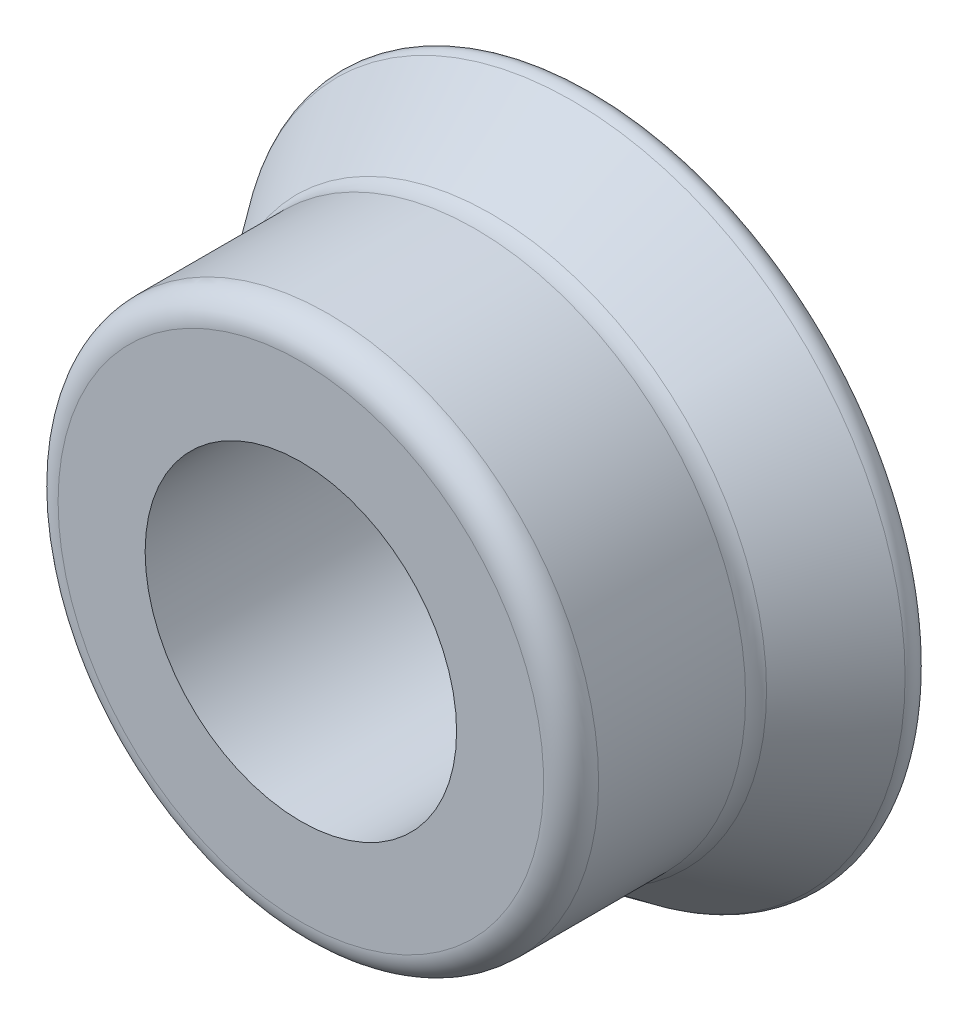
ISO-10303-21;
HEADER;
FILE_DESCRIPTION(('STEP AP214'),'2;1');
FILE_NAME('part.step','',(''),(''),'','','');
FILE_SCHEMA(('AUTOMOTIVE_DESIGN { 1 0 10303 214 1 1 1 1 }'));
ENDSEC;
DATA;
#1=APPLICATION_CONTEXT('core data for automotive mechanical design processes');
#2=APPLICATION_PROTOCOL_DEFINITION('international standard','automotive_design',2000,#1);
#3=PRODUCT_CONTEXT('',#1,'mechanical');
#4=PRODUCT('Part','Part','',(#3));
#5=PRODUCT_RELATED_PRODUCT_CATEGORY('part','',(#4));
#6=PRODUCT_DEFINITION_FORMATION('','',#4);
#7=PRODUCT_DEFINITION_CONTEXT('part definition',#1,'design');
#8=PRODUCT_DEFINITION('design','',#6,#7);
#9=PRODUCT_DEFINITION_SHAPE('','',#8);
#10=(LENGTH_UNIT() NAMED_UNIT(*) SI_UNIT(.MILLI.,.METRE.));
#11=(NAMED_UNIT(*) PLANE_ANGLE_UNIT() SI_UNIT($,.RADIAN.));
#12=(NAMED_UNIT(*) SI_UNIT($,.STERADIAN.) SOLID_ANGLE_UNIT());
#13=UNCERTAINTY_MEASURE_WITH_UNIT(LENGTH_MEASURE(1.E-05),#10,'distance_accuracy_value','');
#14=(GEOMETRIC_REPRESENTATION_CONTEXT(3) GLOBAL_UNCERTAINTY_ASSIGNED_CONTEXT((#13)) GLOBAL_UNIT_ASSIGNED_CONTEXT((#10,
#11,#12)) REPRESENTATION_CONTEXT('',''));
#15=CARTESIAN_POINT('',(0.,0.,0.));
#16=DIRECTION('',(0.,0.,1.));
#17=DIRECTION('',(1.,0.,0.));
#18=AXIS2_PLACEMENT_3D('',#15,#16,#17);
#19=CARTESIAN_POINT('',(0.,0.,0.));
#20=DIRECTION('',(0.,0.,1.));
#21=DIRECTION('',(1.,0.,0.));
#22=AXIS2_PLACEMENT_3D('',#19,#20,#21);
#23=PLANE('',#22);
#24=CARTESIAN_POINT('',(0.,0.,0.));
#25=DIRECTION('',(0.,0.,-1.));
#26=DIRECTION('',(-1.,0.,0.));
#27=AXIS2_PLACEMENT_3D('',#24,#25,#26);
#28=CIRCLE('',#27,3.50993198537684);
#29=CARTESIAN_POINT('',(-3.50993198537684,0.,0.));
#30=VERTEX_POINT('',#29);
#31=EDGE_CURVE('E50',#30,#30,#28,.T.);
#32=ORIENTED_EDGE('',*,*,#31,.T.);
#33=EDGE_LOOP('',(#32));
#34=FACE_BOUND('',#33,.T.);
#35=CARTESIAN_POINT('',(0.,0.,0.));
#36=DIRECTION('',(0.,0.,1.));
#37=DIRECTION('',(1.,0.,0.));
#38=AXIS2_PLACEMENT_3D('',#35,#36,#37);
#39=CIRCLE('',#38,1.7);
#40=CARTESIAN_POINT('',(1.7,0.,0.));
#41=VERTEX_POINT('',#40);
#42=EDGE_CURVE('E69',#41,#41,#39,.F.);
#43=ORIENTED_EDGE('',*,*,#42,.F.);
#44=EDGE_LOOP('',(#43));
#45=FACE_BOUND('',#44,.T.);
#46=ADVANCED_FACE('F37',(#34,#45),#23,.F.);
#47=CARTESIAN_POINT('',(0.,0.,0.15));
#48=DIRECTION('',(0.,0.,-1.));
#49=DIRECTION('',(-1.,0.,0.));
#50=AXIS2_PLACEMENT_3D('',#47,#48,#49);
#51=TOROIDAL_SURFACE('',#50,3.50993198537684,0.15);
#52=ORIENTED_EDGE('',*,*,#31,.F.);
#53=EDGE_LOOP('',(#52));
#54=FACE_BOUND('',#53,.T.);
#55=CARTESIAN_POINT('',(0.,0.,0.236702601117052));
#56=DIRECTION('',(0.,0.,-1.));
#57=DIRECTION('',(-1.,0.,0.));
#58=AXIS2_PLACEMENT_3D('',#55,#56,#57);
#59=CIRCLE('',#58,3.63233565754209);
#60=CARTESIAN_POINT('',(-3.63233565754209,0.,0.236702601117052));
#61=VERTEX_POINT('',#60);
#62=EDGE_CURVE('E55',#61,#61,#59,.T.);
#63=ORIENTED_EDGE('',*,*,#62,.T.);
#64=EDGE_LOOP('',(#63));
#65=FACE_BOUND('',#64,.T.);
#66=ADVANCED_FACE('F82',(#54,#65),#51,.T.);
#67=CARTESIAN_POINT('',(0.,0.,1.12208095670188));
#68=DIRECTION('',(0.,0.,-1.));
#69=DIRECTION('',(-1.,0.,0.));
#70=AXIS2_PLACEMENT_3D('',#67,#68,#69);
#71=CONICAL_SURFACE('',#70,3.0051926556695,0.616296937396071);
#72=ORIENTED_EDGE('',*,*,#62,.F.);
#73=EDGE_LOOP('',(#72));
#74=FACE_BOUND('',#73,.T.);
#75=CARTESIAN_POINT('',(0.,0.,1.12208095670188));
#76=DIRECTION('',(0.,0.,-1.));
#77=DIRECTION('',(-1.,0.,0.));
#78=AXIS2_PLACEMENT_3D('',#75,#76,#77);
#79=CIRCLE('',#78,3.0051926556695);
#80=CARTESIAN_POINT('',(-3.0051926556695,0.,1.12208095670188));
#81=VERTEX_POINT('',#80);
#82=EDGE_CURVE('E61',#81,#81,#79,.T.);
#83=ORIENTED_EDGE('',*,*,#82,.T.);
#84=EDGE_LOOP('',(#83));
#85=FACE_BOUND('',#84,.T.);
#86=ADVANCED_FACE('F87',(#74,#85),#71,.T.);
#87=CARTESIAN_POINT('',(0.,0.,1.29548615893598));
#88=DIRECTION('',(0.,0.,-1.));
#89=DIRECTION('',(-1.,0.,0.));
#90=AXIS2_PLACEMENT_3D('',#87,#88,#89);
#91=TOROIDAL_SURFACE('',#90,3.25,0.3);
#92=ORIENTED_EDGE('',*,*,#82,.F.);
#93=EDGE_LOOP('',(#92));
#94=FACE_BOUND('',#93,.T.);
#95=CARTESIAN_POINT('',(0.,0.,1.29548615893598));
#96=DIRECTION('',(0.,0.,-1.));
#97=DIRECTION('',(-1.,0.,0.));
#98=AXIS2_PLACEMENT_3D('',#95,#96,#97);
#99=CIRCLE('',#98,2.95);
#100=CARTESIAN_POINT('',(-2.95,0.,1.29548615893598));
#101=VERTEX_POINT('',#100);
#102=EDGE_CURVE('E65',#101,#101,#99,.T.);
#103=ORIENTED_EDGE('',*,*,#102,.T.);
#104=EDGE_LOOP('',(#103));
#105=FACE_BOUND('',#104,.T.);
#106=ADVANCED_FACE('F93',(#94,#105),#91,.F.);
#107=CARTESIAN_POINT('',(0.,0.,0.));
#108=DIRECTION('',(0.,0.,-1.));
#109=DIRECTION('',(-1.,0.,0.));
#110=AXIS2_PLACEMENT_3D('',#107,#108,#109);
#111=CYLINDRICAL_SURFACE('',#110,2.95);
#112=CARTESIAN_POINT('',(0.,0.,2.9));
#113=DIRECTION('',(0.,0.,-1.));
#114=DIRECTION('',(-1.,0.,0.));
#115=AXIS2_PLACEMENT_3D('',#112,#113,#114);
#116=CIRCLE('',#115,2.95);
#117=CARTESIAN_POINT('',(-2.95,0.,2.9));
#118=VERTEX_POINT('',#117);
#119=EDGE_CURVE('E45',#118,#118,#116,.T.);
#120=ORIENTED_EDGE('',*,*,#119,.T.);
#121=EDGE_LOOP('',(#120));
#122=FACE_BOUND('',#121,.T.);
#123=ORIENTED_EDGE('',*,*,#102,.F.);
#124=EDGE_LOOP('',(#123));
#125=FACE_BOUND('',#124,.T.);
#126=ADVANCED_FACE('F97',(#122,#125),#111,.T.);
#127=CARTESIAN_POINT('',(1.7,0.,3.2));
#128=DIRECTION('',(0.,0.,-1.));
#129=DIRECTION('',(-1.,0.,0.));
#130=AXIS2_PLACEMENT_3D('',#127,#128,#129);
#131=PLANE('',#130);
#132=CARTESIAN_POINT('',(0.,0.,3.2));
#133=DIRECTION('',(0.,0.,-1.));
#134=DIRECTION('',(-1.,0.,0.));
#135=AXIS2_PLACEMENT_3D('',#132,#133,#134);
#136=CIRCLE('',#135,2.65);
#137=CARTESIAN_POINT('',(-2.65,0.,3.2));
#138=VERTEX_POINT('',#137);
#139=EDGE_CURVE('E10',#138,#138,#136,.F.);
#140=ORIENTED_EDGE('',*,*,#139,.T.);
#141=EDGE_LOOP('',(#140));
#142=FACE_BOUND('',#141,.T.);
#143=CARTESIAN_POINT('',(0.,0.,3.2));
#144=DIRECTION('',(0.,0.,1.));
#145=DIRECTION('',(1.,0.,0.));
#146=AXIS2_PLACEMENT_3D('',#143,#144,#145);
#147=CIRCLE('',#146,1.7);
#148=CARTESIAN_POINT('',(1.7,0.,3.2));
#149=VERTEX_POINT('',#148);
#150=EDGE_CURVE('E70',#149,#149,#147,.T.);
#151=ORIENTED_EDGE('',*,*,#150,.F.);
#152=EDGE_LOOP('',(#151));
#153=FACE_BOUND('',#152,.T.);
#154=ADVANCED_FACE('F101',(#142,#153),#131,.F.);
#155=CARTESIAN_POINT('',(0.,0.,3.7));
#156=DIRECTION('',(0.,0.,1.));
#157=DIRECTION('',(1.,0.,0.));
#158=AXIS2_PLACEMENT_3D('',#155,#156,#157);
#159=CYLINDRICAL_SURFACE('',#158,1.7);
#160=ORIENTED_EDGE('',*,*,#42,.T.);
#161=EDGE_LOOP('',(#160));
#162=FACE_BOUND('',#161,.T.);
#163=ORIENTED_EDGE('',*,*,#150,.T.);
#164=EDGE_LOOP('',(#163));
#165=FACE_BOUND('',#164,.T.);
#166=ADVANCED_FACE('F78',(#162,#165),#159,.F.);
#167=CARTESIAN_POINT('',(0.,0.,2.9));
#168=DIRECTION('',(0.,0.,-1.));
#169=DIRECTION('',(-1.,0.,0.));
#170=AXIS2_PLACEMENT_3D('',#167,#168,#169);
#171=TOROIDAL_SURFACE('',#170,2.65,0.3);
#172=ORIENTED_EDGE('',*,*,#139,.F.);
#173=EDGE_LOOP('',(#172));
#174=FACE_BOUND('',#173,.T.);
#175=ORIENTED_EDGE('',*,*,#119,.F.);
#176=EDGE_LOOP('',(#175));
#177=FACE_BOUND('',#176,.T.);
#178=ADVANCED_FACE('F39',(#174,#177),#171,.T.);
#179=CLOSED_SHELL('',(#46,#66,#86,#106,#126,#154,#166,#178));
#180=MANIFOLD_SOLID_BREP('B2',#179);
#181=ADVANCED_BREP_SHAPE_REPRESENTATION('',(#18,#180),#14);
#182=SHAPE_DEFINITION_REPRESENTATION(#9,#181);
ENDSEC;
END-ISO-10303-21;
